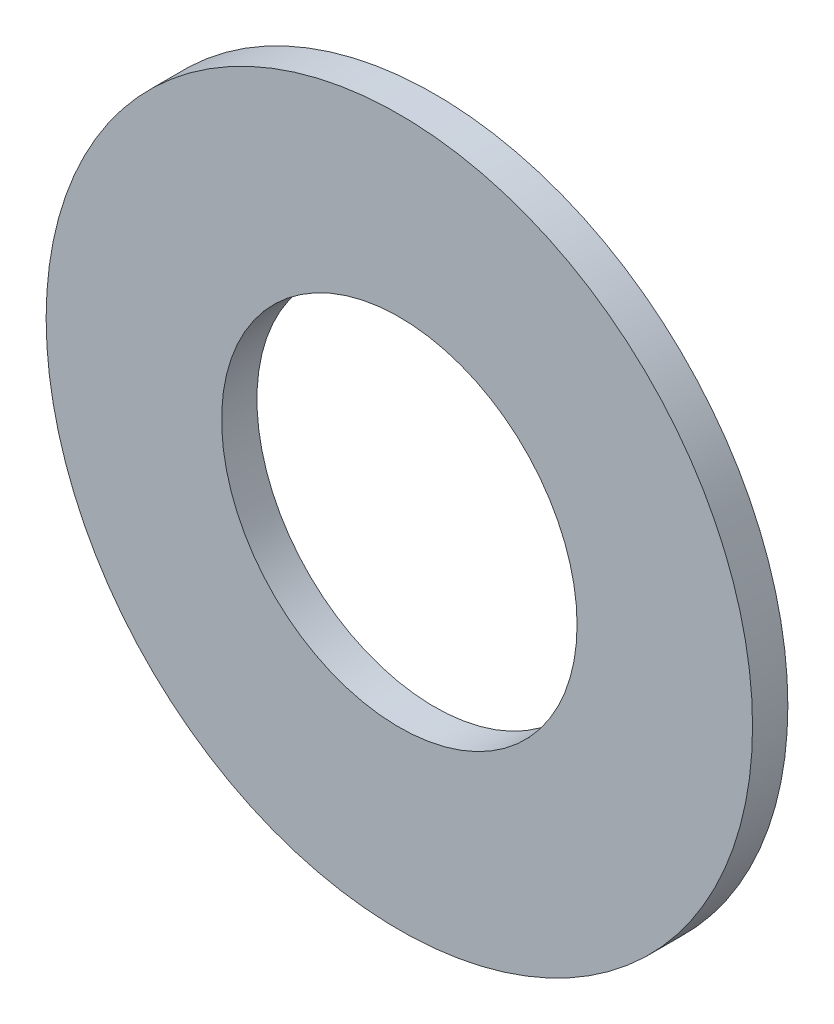
ISO-10303-21;
HEADER;
FILE_DESCRIPTION(('STEP AP214'),'2;1');
FILE_NAME('part.step','',(''),(''),'','','');
FILE_SCHEMA(('AUTOMOTIVE_DESIGN { 1 0 10303 214 1 1 1 1 }'));
ENDSEC;
DATA;
#1=APPLICATION_CONTEXT('core data for automotive mechanical design processes');
#2=APPLICATION_PROTOCOL_DEFINITION('international standard','automotive_design',2000,#1);
#3=PRODUCT_CONTEXT('',#1,'mechanical');
#4=PRODUCT('Part','Part','',(#3));
#5=PRODUCT_RELATED_PRODUCT_CATEGORY('part','',(#4));
#6=PRODUCT_DEFINITION_FORMATION('','',#4);
#7=PRODUCT_DEFINITION_CONTEXT('part definition',#1,'design');
#8=PRODUCT_DEFINITION('design','',#6,#7);
#9=PRODUCT_DEFINITION_SHAPE('','',#8);
#10=(LENGTH_UNIT() NAMED_UNIT(*) SI_UNIT(.MILLI.,.METRE.));
#11=(NAMED_UNIT(*) PLANE_ANGLE_UNIT() SI_UNIT($,.RADIAN.));
#12=(NAMED_UNIT(*) SI_UNIT($,.STERADIAN.) SOLID_ANGLE_UNIT());
#13=UNCERTAINTY_MEASURE_WITH_UNIT(LENGTH_MEASURE(1.E-05),#10,'distance_accuracy_value','');
#14=(GEOMETRIC_REPRESENTATION_CONTEXT(3) GLOBAL_UNCERTAINTY_ASSIGNED_CONTEXT((#13)) GLOBAL_UNIT_ASSIGNED_CONTEXT((#10,
#11,#12)) REPRESENTATION_CONTEXT('',''));
#15=CARTESIAN_POINT('',(0.,0.,0.));
#16=DIRECTION('',(0.,0.,1.));
#17=DIRECTION('',(1.,0.,0.));
#18=AXIS2_PLACEMENT_3D('',#15,#16,#17);
#19=CARTESIAN_POINT('',(0.,0.,0.79375));
#20=DIRECTION('',(0.,0.,1.));
#21=DIRECTION('',(1.,0.,0.));
#22=AXIS2_PLACEMENT_3D('',#19,#20,#21);
#23=PLANE('',#22);
#24=CARTESIAN_POINT('',(0.,0.,0.79375));
#25=DIRECTION('',(0.,0.,1.));
#26=DIRECTION('',(1.,0.,0.));
#27=AXIS2_PLACEMENT_3D('',#24,#25,#26);
#28=CIRCLE('',#27,15.875);
#29=CARTESIAN_POINT('',(15.875,0.,0.79375));
#30=VERTEX_POINT('',#29);
#31=EDGE_CURVE('E10',#30,#30,#28,.T.);
#32=ORIENTED_EDGE('',*,*,#31,.T.);
#33=EDGE_LOOP('',(#32));
#34=FACE_BOUND('',#33,.T.);
#35=CARTESIAN_POINT('',(0.,0.,0.79375));
#36=DIRECTION('',(0.,0.,1.));
#37=DIRECTION('',(1.,0.,0.));
#38=AXIS2_PLACEMENT_3D('',#35,#36,#37);
#39=CIRCLE('',#38,7.9883);
#40=CARTESIAN_POINT('',(7.9883,0.,0.79375));
#41=VERTEX_POINT('',#40);
#42=EDGE_CURVE('E43',#41,#41,#39,.T.);
#43=ORIENTED_EDGE('',*,*,#42,.F.);
#44=EDGE_LOOP('',(#43));
#45=FACE_BOUND('',#44,.T.);
#46=ADVANCED_FACE('F32',(#34,#45),#23,.T.);
#47=CARTESIAN_POINT('',(0.,0.,-0.79375));
#48=DIRECTION('',(0.,0.,1.));
#49=DIRECTION('',(1.,0.,0.));
#50=AXIS2_PLACEMENT_3D('',#47,#48,#49);
#51=PLANE('',#50);
#52=CARTESIAN_POINT('',(0.,0.,-0.79375));
#53=DIRECTION('',(0.,0.,1.));
#54=DIRECTION('',(1.,0.,0.));
#55=AXIS2_PLACEMENT_3D('',#52,#53,#54);
#56=CIRCLE('',#55,15.875);
#57=CARTESIAN_POINT('',(15.875,0.,-0.79375));
#58=VERTEX_POINT('',#57);
#59=EDGE_CURVE('E36',#58,#58,#56,.T.);
#60=ORIENTED_EDGE('',*,*,#59,.F.);
#61=EDGE_LOOP('',(#60));
#62=FACE_BOUND('',#61,.T.);
#63=CARTESIAN_POINT('',(0.,0.,-0.79375));
#64=DIRECTION('',(0.,0.,1.));
#65=DIRECTION('',(1.,0.,0.));
#66=AXIS2_PLACEMENT_3D('',#63,#64,#65);
#67=CIRCLE('',#66,7.9883);
#68=CARTESIAN_POINT('',(7.9883,0.,-0.79375));
#69=VERTEX_POINT('',#68);
#70=EDGE_CURVE('E45',#69,#69,#67,.T.);
#71=ORIENTED_EDGE('',*,*,#70,.T.);
#72=EDGE_LOOP('',(#71));
#73=FACE_BOUND('',#72,.T.);
#74=ADVANCED_FACE('F55',(#62,#73),#51,.F.);
#75=CARTESIAN_POINT('',(0.,0.,0.79375));
#76=DIRECTION('',(0.,0.,-1.));
#77=DIRECTION('',(-1.,0.,0.));
#78=AXIS2_PLACEMENT_3D('',#75,#76,#77);
#79=CYLINDRICAL_SURFACE('',#78,15.875);
#80=ORIENTED_EDGE('',*,*,#31,.F.);
#81=EDGE_LOOP('',(#80));
#82=FACE_BOUND('',#81,.T.);
#83=ORIENTED_EDGE('',*,*,#59,.T.);
#84=EDGE_LOOP('',(#83));
#85=FACE_BOUND('',#84,.T.);
#86=ADVANCED_FACE('F34',(#82,#85),#79,.T.);
#87=CARTESIAN_POINT('',(0.,0.,0.79375));
#88=DIRECTION('',(0.,0.,-1.));
#89=DIRECTION('',(-1.,0.,0.));
#90=AXIS2_PLACEMENT_3D('',#87,#88,#89);
#91=CYLINDRICAL_SURFACE('',#90,7.9883);
#92=ORIENTED_EDGE('',*,*,#42,.T.);
#93=EDGE_LOOP('',(#92));
#94=FACE_BOUND('',#93,.T.);
#95=ORIENTED_EDGE('',*,*,#70,.F.);
#96=EDGE_LOOP('',(#95));
#97=FACE_BOUND('',#96,.T.);
#98=ADVANCED_FACE('F51',(#94,#97),#91,.F.);
#99=CLOSED_SHELL('',(#46,#74,#86,#98));
#100=MANIFOLD_SOLID_BREP('B2',#99);
#101=ADVANCED_BREP_SHAPE_REPRESENTATION('',(#18,#100),#14);
#102=SHAPE_DEFINITION_REPRESENTATION(#9,#101);
ENDSEC;
END-ISO-10303-21;
